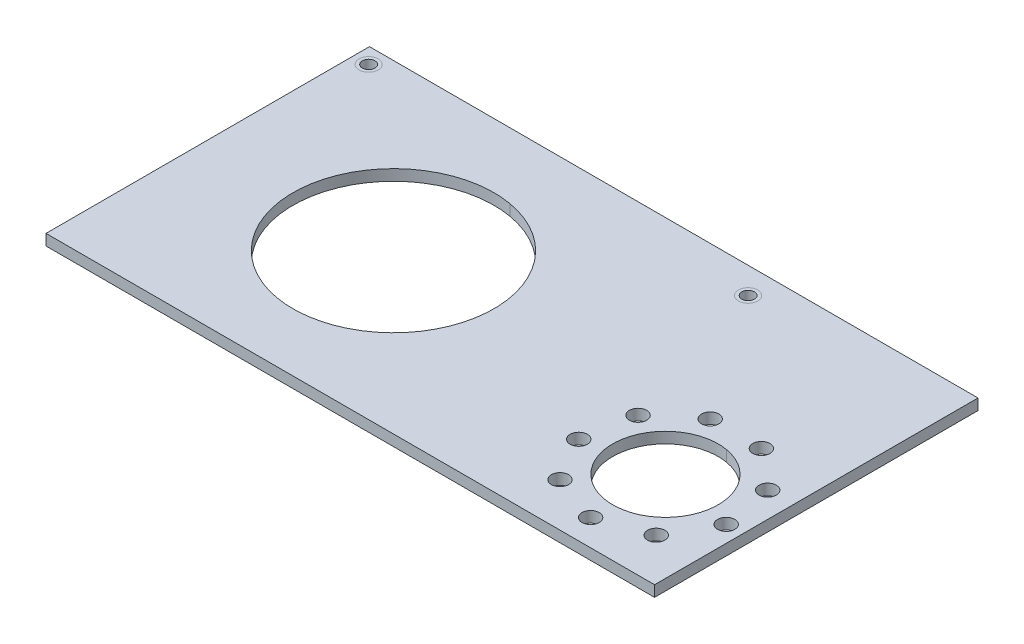
ISO-10303-21;
HEADER;
FILE_DESCRIPTION(('STEP AP214'),'2;1');
FILE_NAME('part.step','',(''),(''),'','','');
FILE_SCHEMA(('AUTOMOTIVE_DESIGN { 1 0 10303 214 1 1 1 1 }'));
ENDSEC;
DATA;
#1=APPLICATION_CONTEXT('core data for automotive mechanical design processes');
#2=APPLICATION_PROTOCOL_DEFINITION('international standard','automotive_design',2000,#1);
#3=PRODUCT_CONTEXT('',#1,'mechanical');
#4=PRODUCT('Part','Part','',(#3));
#5=PRODUCT_RELATED_PRODUCT_CATEGORY('part','',(#4));
#6=PRODUCT_DEFINITION_FORMATION('','',#4);
#7=PRODUCT_DEFINITION_CONTEXT('part definition',#1,'design');
#8=PRODUCT_DEFINITION('design','',#6,#7);
#9=PRODUCT_DEFINITION_SHAPE('','',#8);
#10=(LENGTH_UNIT() NAMED_UNIT(*) SI_UNIT(.MILLI.,.METRE.));
#11=(NAMED_UNIT(*) PLANE_ANGLE_UNIT() SI_UNIT($,.RADIAN.));
#12=(NAMED_UNIT(*) SI_UNIT($,.STERADIAN.) SOLID_ANGLE_UNIT());
#13=UNCERTAINTY_MEASURE_WITH_UNIT(LENGTH_MEASURE(1.E-05),#10,'distance_accuracy_value','');
#14=(GEOMETRIC_REPRESENTATION_CONTEXT(3) GLOBAL_UNCERTAINTY_ASSIGNED_CONTEXT((#13)) GLOBAL_UNIT_ASSIGNED_CONTEXT((#10,
#11,#12)) REPRESENTATION_CONTEXT('',''));
#15=CARTESIAN_POINT('',(0.,0.,0.));
#16=DIRECTION('',(0.,0.,1.));
#17=DIRECTION('',(1.,0.,0.));
#18=AXIS2_PLACEMENT_3D('',#15,#16,#17);
#19=CARTESIAN_POINT('',(0.,0.,0.));
#20=DIRECTION('',(0.,1.,0.));
#21=DIRECTION('',(0.,0.,1.));
#22=AXIS2_PLACEMENT_3D('',#19,#20,#21);
#23=PLANE('',#22);
#24=CARTESIAN_POINT('',(-556.683214871715,0.,24.7614199820488));
#25=DIRECTION('',(0.,1.,0.));
#26=DIRECTION('',(0.,0.,1.));
#27=AXIS2_PLACEMENT_3D('',#24,#25,#26);
#28=CIRCLE('',#27,5.00000000000004);
#29=CARTESIAN_POINT('',(-556.683214871715,0.,29.7614199820489));
#30=VERTEX_POINT('',#29);
#31=EDGE_CURVE('E52',#30,#30,#28,.F.);
#32=ORIENTED_EDGE('',*,*,#31,.F.);
#33=EDGE_LOOP('',(#32));
#34=FACE_BOUND('',#33,.T.);
#35=CARTESIAN_POINT('',(-497.518508898,0.,166.));
#36=DIRECTION('',(0.,1.,0.));
#37=DIRECTION('',(0.,0.,1.));
#38=AXIS2_PLACEMENT_3D('',#35,#36,#37);
#39=CIRCLE('',#38,4.50000000000002);
#40=CARTESIAN_POINT('',(-497.518508898,0.,170.5));
#41=VERTEX_POINT('',#40);
#42=EDGE_CURVE('E179',#41,#41,#39,.T.);
#43=ORIENTED_EDGE('',*,*,#42,.T.);
#44=EDGE_LOOP('',(#43));
#45=FACE_BOUND('',#44,.T.);
#46=CARTESIAN_POINT('',(-522.587225675775,0.,156.87573328164));
#47=DIRECTION('',(0.,1.,0.));
#48=DIRECTION('',(0.,0.,1.));
#49=AXIS2_PLACEMENT_3D('',#46,#47,#48);
#50=CIRCLE('',#49,4.50000000000002);
#51=CARTESIAN_POINT('',(-522.587225675775,0.,161.375733281641));
#52=VERTEX_POINT('',#51);
#53=EDGE_CURVE('E183',#52,#52,#50,.T.);
#54=ORIENTED_EDGE('',*,*,#53,.T.);
#55=EDGE_LOOP('',(#54));
#56=FACE_BOUND('',#55,.T.);
#57=CARTESIAN_POINT('',(-472.449792120225,0.,156.87573328164));
#58=DIRECTION('',(0.,1.,0.));
#59=DIRECTION('',(0.,0.,1.));
#60=AXIS2_PLACEMENT_3D('',#57,#58,#59);
#61=CIRCLE('',#60,4.49999999999996);
#62=CARTESIAN_POINT('',(-472.449792120225,0.,161.37573328164));
#63=VERTEX_POINT('',#62);
#64=EDGE_CURVE('E187',#63,#63,#61,.T.);
#65=ORIENTED_EDGE('',*,*,#64,.T.);
#66=EDGE_LOOP('',(#65));
#67=FACE_BOUND('',#66,.T.);
#68=CARTESIAN_POINT('',(-535.926011265476,0.,133.772278929011));
#69=DIRECTION('',(0.,1.,0.));
#70=DIRECTION('',(0.,0.,1.));
#71=AXIS2_PLACEMENT_3D('',#68,#69,#70);
#72=CIRCLE('',#71,4.50000000000002);
#73=CARTESIAN_POINT('',(-535.926011265476,0.,138.272278929011));
#74=VERTEX_POINT('',#73);
#75=EDGE_CURVE('E191',#74,#74,#72,.T.);
#76=ORIENTED_EDGE('',*,*,#75,.T.);
#77=EDGE_LOOP('',(#76));
#78=FACE_BOUND('',#77,.T.);
#79=CARTESIAN_POINT('',(-459.111006530524,0.,133.77227892901));
#80=DIRECTION('',(0.,1.,0.));
#81=DIRECTION('',(0.,0.,1.));
#82=AXIS2_PLACEMENT_3D('',#79,#80,#81);
#83=CIRCLE('',#82,4.49999999999996);
#84=CARTESIAN_POINT('',(-459.111006530524,0.,138.27227892901));
#85=VERTEX_POINT('',#84);
#86=EDGE_CURVE('E195',#85,#85,#83,.T.);
#87=ORIENTED_EDGE('',*,*,#86,.T.);
#88=EDGE_LOOP('',(#87));
#89=FACE_BOUND('',#88,.T.);
#90=CARTESIAN_POINT('',(-497.518508898,0.,127.));
#91=DIRECTION('',(0.,1.,0.));
#92=DIRECTION('',(0.,0.,1.));
#93=AXIS2_PLACEMENT_3D('',#90,#91,#92);
#94=CIRCLE('',#93,27.4955);
#95=CARTESIAN_POINT('',(-492.780583099284,0.,99.9157872668253));
#96=VERTEX_POINT('',#95);
#97=CARTESIAN_POINT('',(-502.256434696716,0.,154.084212733175));
#98=VERTEX_POINT('',#97);
#99=EDGE_CURVE('E198',#96,#98,#94,.T.);
#100=ORIENTED_EDGE('',*,*,#99,.T.);
#101=EDGE_CURVE('E262',#98,#96,#94,.T.);
#102=ORIENTED_EDGE('',*,*,#101,.T.);
#103=EDGE_LOOP('',(#100,#102));
#104=FACE_BOUND('',#103,.T.);
#105=CARTESIAN_POINT('',(-531.293499645593,0.,107.5));
#106=DIRECTION('',(0.,1.,0.));
#107=DIRECTION('',(0.,0.,1.));
#108=AXIS2_PLACEMENT_3D('',#105,#106,#107);
#109=CIRCLE('',#108,4.50000000000002);
#110=CARTESIAN_POINT('',(-531.293499645593,0.,112.));
#111=VERTEX_POINT('',#110);
#112=EDGE_CURVE('E202',#111,#111,#109,.T.);
#113=ORIENTED_EDGE('',*,*,#112,.T.);
#114=EDGE_LOOP('',(#113));
#115=FACE_BOUND('',#114,.T.);
#116=CARTESIAN_POINT('',(-463.743518150407,0.,107.5));
#117=DIRECTION('',(0.,1.,0.));
#118=DIRECTION('',(0.,0.,1.));
#119=AXIS2_PLACEMENT_3D('',#116,#117,#118);
#120=CIRCLE('',#119,4.49999999999996);
#121=CARTESIAN_POINT('',(-463.743518150407,0.,112.));
#122=VERTEX_POINT('',#121);
#123=EDGE_CURVE('E206',#122,#122,#120,.T.);
#124=ORIENTED_EDGE('',*,*,#123,.T.);
#125=EDGE_LOOP('',(#124));
#126=FACE_BOUND('',#125,.T.);
#127=CARTESIAN_POINT('',(-510.857294487701,0.,90.3519877893497));
#128=DIRECTION('',(0.,1.,0.));
#129=DIRECTION('',(0.,0.,1.));
#130=AXIS2_PLACEMENT_3D('',#127,#128,#129);
#131=CIRCLE('',#130,4.50000000000002);
#132=CARTESIAN_POINT('',(-510.857294487701,0.,94.8519877893497));
#133=VERTEX_POINT('',#132);
#134=EDGE_CURVE('E210',#133,#133,#131,.T.);
#135=ORIENTED_EDGE('',*,*,#134,.T.);
#136=EDGE_LOOP('',(#135));
#137=FACE_BOUND('',#136,.T.);
#138=CARTESIAN_POINT('',(-484.179723308299,0.,90.3519877893495));
#139=DIRECTION('',(0.,1.,0.));
#140=DIRECTION('',(0.,0.,1.));
#141=AXIS2_PLACEMENT_3D('',#138,#139,#140);
#142=CIRCLE('',#141,4.49999999999996);
#143=CARTESIAN_POINT('',(-484.179723308299,0.,94.8519877893495));
#144=VERTEX_POINT('',#143);
#145=EDGE_CURVE('E214',#144,#144,#142,.T.);
#146=ORIENTED_EDGE('',*,*,#145,.T.);
#147=EDGE_LOOP('',(#146));
#148=FACE_BOUND('',#147,.T.);
#149=DIRECTION('',(0.,0.,1.));
#150=VECTOR('',#149,1.);
#151=CARTESIAN_POINT('',(-767.637595370689,0.,11.1167158933512));
#152=LINE('',#151,#150);
#153=CARTESIAN_POINT('',(-767.637595370689,0.,11.1167158933512));
#154=VERTEX_POINT('',#153);
#155=CARTESIAN_POINT('',(-767.637595370689,0.,179.652791477189));
#156=VERTEX_POINT('',#155);
#157=EDGE_CURVE('E132',#154,#156,#152,.T.);
#158=ORIENTED_EDGE('',*,*,#157,.F.);
#159=DIRECTION('',(-1.,0.,0.));
#160=VECTOR('',#159,1.);
#161=CARTESIAN_POINT('',(-767.637595370689,0.,11.1167158933512));
#162=LINE('',#161,#160);
#163=CARTESIAN_POINT('',(-450.542678287043,0.,11.1167158933512));
#164=VERTEX_POINT('',#163);
#165=EDGE_CURVE('E129',#164,#154,#162,.T.);
#166=ORIENTED_EDGE('',*,*,#165,.F.);
#167=DIRECTION('',(0.,0.,-1.));
#168=VECTOR('',#167,1.);
#169=CARTESIAN_POINT('',(-450.542678287043,0.,11.1167158933512));
#170=LINE('',#169,#168);
#171=CARTESIAN_POINT('',(-450.542678287043,0.,179.652791477189));
#172=VERTEX_POINT('',#171);
#173=EDGE_CURVE('E290',#172,#164,#170,.T.);
#174=ORIENTED_EDGE('',*,*,#173,.F.);
#175=DIRECTION('',(1.,0.,0.));
#176=VECTOR('',#175,1.);
#177=CARTESIAN_POINT('',(-767.637595370689,0.,179.652791477189));
#178=LINE('',#177,#176);
#179=EDGE_CURVE('E288',#156,#172,#178,.T.);
#180=ORIENTED_EDGE('',*,*,#179,.F.);
#181=EDGE_LOOP('',(#158,#166,#174,#180));
#182=FACE_BOUND('',#181,.T.);
#183=CARTESIAN_POINT('',(-759.817588697628,0.,19.3463383980246));
#184=DIRECTION('',(0.,1.,0.));
#185=DIRECTION('',(0.,0.,1.));
#186=AXIS2_PLACEMENT_3D('',#183,#184,#185);
#187=CIRCLE('',#186,5.00000000000004);
#188=CARTESIAN_POINT('',(-759.817588697628,0.,24.3463383980246));
#189=VERTEX_POINT('',#188);
#190=EDGE_CURVE('E159',#189,#189,#187,.F.);
#191=ORIENTED_EDGE('',*,*,#190,.F.);
#192=EDGE_LOOP('',(#191));
#193=FACE_BOUND('',#192,.T.);
#194=CARTESIAN_POINT('',(-669.29,0.,96.9514773719377));
#195=DIRECTION('',(0.,1.,0.));
#196=DIRECTION('',(0.,0.,1.));
#197=AXIS2_PLACEMENT_3D('',#194,#195,#196);
#198=CIRCLE('',#197,61.9125);
#199=CARTESIAN_POINT('',(-669.29,0.,158.863977371938));
#200=VERTEX_POINT('',#199);
#201=EDGE_CURVE('E11',#200,#200,#198,.F.);
#202=ORIENTED_EDGE('',*,*,#201,.F.);
#203=EDGE_LOOP('',(#202));
#204=FACE_BOUND('',#203,.T.);
#205=ADVANCED_FACE('F43',(#34,#45,#56,#67,#78,#89,#104,#115,#126,#137,#148,#182,#193,#204),#23,.F.);
#206=ORIENTED_EDGE('',*,*,#201,.T.);
#207=EDGE_LOOP('',(#206));
#208=FACE_BOUND('',#207,.T.);
#209=CARTESIAN_POINT('',(-669.29,0.,96.9514773719377));
#210=DIRECTION('',(0.,1.,0.));
#211=DIRECTION('',(0.,0.,1.));
#212=AXIS2_PLACEMENT_3D('',#209,#210,#211);
#213=CIRCLE('',#212,52.3875);
#214=CARTESIAN_POINT('',(-660.262774171038,0.,45.347607845681));
#215=VERTEX_POINT('',#214);
#216=CARTESIAN_POINT('',(-678.317225828962,0.,148.555346898194));
#217=VERTEX_POINT('',#216);
#218=EDGE_CURVE('E225',#215,#217,#213,.T.);
#219=ORIENTED_EDGE('',*,*,#218,.T.);
#220=EDGE_CURVE('E227',#217,#215,#213,.T.);
#221=ORIENTED_EDGE('',*,*,#220,.T.);
#222=EDGE_LOOP('',(#219,#221));
#223=FACE_BOUND('',#222,.T.);
#224=ADVANCED_FACE('F173',(#208,#223),#23,.F.);
#225=ORIENTED_EDGE('',*,*,#31,.T.);
#226=EDGE_LOOP('',(#225));
#227=FACE_BOUND('',#226,.T.);
#228=CARTESIAN_POINT('',(-556.683214871715,0.,24.7614199820488));
#229=DIRECTION('',(0.,1.,0.));
#230=DIRECTION('',(0.,0.,1.));
#231=AXIS2_PLACEMENT_3D('',#228,#229,#230);
#232=CIRCLE('',#231,3.30000000000019);
#233=CARTESIAN_POINT('',(-556.683214871715,0.,28.061419982049));
#234=VERTEX_POINT('',#233);
#235=EDGE_CURVE('E240',#234,#234,#232,.T.);
#236=ORIENTED_EDGE('',*,*,#235,.T.);
#237=EDGE_LOOP('',(#236));
#238=FACE_BOUND('',#237,.T.);
#239=ADVANCED_FACE('F168',(#227,#238),#23,.F.);
#240=CARTESIAN_POINT('',(0.,5.715,0.));
#241=DIRECTION('',(0.,1.,0.));
#242=DIRECTION('',(0.,0.,1.));
#243=AXIS2_PLACEMENT_3D('',#240,#241,#242);
#244=PLANE('',#243);
#245=CARTESIAN_POINT('',(-556.683214871715,5.715,24.7614199820488));
#246=DIRECTION('',(0.,1.,0.));
#247=DIRECTION('',(0.,0.,1.));
#248=AXIS2_PLACEMENT_3D('',#245,#246,#247);
#249=CIRCLE('',#248,5.00000000000004);
#250=CARTESIAN_POINT('',(-556.683214871715,5.715,29.7614199820489));
#251=VERTEX_POINT('',#250);
#252=EDGE_CURVE('E151',#251,#251,#249,.F.);
#253=ORIENTED_EDGE('',*,*,#252,.T.);
#254=EDGE_LOOP('',(#253));
#255=FACE_BOUND('',#254,.T.);
#256=CARTESIAN_POINT('',(-669.29,5.715,96.9514773719377));
#257=DIRECTION('',(0.,1.,0.));
#258=DIRECTION('',(0.,0.,1.));
#259=AXIS2_PLACEMENT_3D('',#256,#257,#258);
#260=CIRCLE('',#259,52.3875);
#261=CARTESIAN_POINT('',(-660.262774171038,5.715,45.347607845681));
#262=VERTEX_POINT('',#261);
#263=CARTESIAN_POINT('',(-678.317225828962,5.715,148.555346898194));
#264=VERTEX_POINT('',#263);
#265=EDGE_CURVE('E232',#262,#264,#260,.T.);
#266=ORIENTED_EDGE('',*,*,#265,.F.);
#267=EDGE_CURVE('E230',#264,#262,#260,.T.);
#268=ORIENTED_EDGE('',*,*,#267,.F.);
#269=EDGE_LOOP('',(#266,#268));
#270=FACE_BOUND('',#269,.T.);
#271=CARTESIAN_POINT('',(-497.518508898,5.715,166.));
#272=DIRECTION('',(0.,1.,0.));
#273=DIRECTION('',(0.,0.,1.));
#274=AXIS2_PLACEMENT_3D('',#271,#272,#273);
#275=CIRCLE('',#274,4.50000000000002);
#276=CARTESIAN_POINT('',(-497.518508898,5.715,170.5));
#277=VERTEX_POINT('',#276);
#278=EDGE_CURVE('E243',#277,#277,#275,.T.);
#279=ORIENTED_EDGE('',*,*,#278,.F.);
#280=EDGE_LOOP('',(#279));
#281=FACE_BOUND('',#280,.T.);
#282=CARTESIAN_POINT('',(-472.449792120225,5.715,156.87573328164));
#283=DIRECTION('',(0.,1.,0.));
#284=DIRECTION('',(0.,0.,1.));
#285=AXIS2_PLACEMENT_3D('',#282,#283,#284);
#286=CIRCLE('',#285,4.49999999999996);
#287=CARTESIAN_POINT('',(-472.449792120225,5.715,161.37573328164));
#288=VERTEX_POINT('',#287);
#289=EDGE_CURVE('E251',#288,#288,#286,.T.);
#290=ORIENTED_EDGE('',*,*,#289,.F.);
#291=EDGE_LOOP('',(#290));
#292=FACE_BOUND('',#291,.T.);
#293=CARTESIAN_POINT('',(-459.111006530524,5.715,133.77227892901));
#294=DIRECTION('',(0.,1.,0.));
#295=DIRECTION('',(0.,0.,1.));
#296=AXIS2_PLACEMENT_3D('',#293,#294,#295);
#297=CIRCLE('',#296,4.49999999999996);
#298=CARTESIAN_POINT('',(-459.111006530524,5.715,138.27227892901));
#299=VERTEX_POINT('',#298);
#300=EDGE_CURVE('E259',#299,#299,#297,.T.);
#301=ORIENTED_EDGE('',*,*,#300,.F.);
#302=EDGE_LOOP('',(#301));
#303=FACE_BOUND('',#302,.T.);
#304=CARTESIAN_POINT('',(-531.293499645593,5.715,107.5));
#305=DIRECTION('',(0.,1.,0.));
#306=DIRECTION('',(0.,0.,1.));
#307=AXIS2_PLACEMENT_3D('',#304,#305,#306);
#308=CIRCLE('',#307,4.50000000000002);
#309=CARTESIAN_POINT('',(-531.293499645593,5.715,112.));
#310=VERTEX_POINT('',#309);
#311=EDGE_CURVE('E268',#310,#310,#308,.T.);
#312=ORIENTED_EDGE('',*,*,#311,.F.);
#313=EDGE_LOOP('',(#312));
#314=FACE_BOUND('',#313,.T.);
#315=CARTESIAN_POINT('',(-510.857294487701,5.715,90.3519877893497));
#316=DIRECTION('',(0.,1.,0.));
#317=DIRECTION('',(0.,0.,1.));
#318=AXIS2_PLACEMENT_3D('',#315,#316,#317);
#319=CIRCLE('',#318,4.50000000000002);
#320=CARTESIAN_POINT('',(-510.857294487701,5.715,94.8519877893497));
#321=VERTEX_POINT('',#320);
#322=EDGE_CURVE('E276',#321,#321,#319,.T.);
#323=ORIENTED_EDGE('',*,*,#322,.F.);
#324=EDGE_LOOP('',(#323));
#325=FACE_BOUND('',#324,.T.);
#326=DIRECTION('',(0.,0.,1.));
#327=VECTOR('',#326,1.);
#328=CARTESIAN_POINT('',(-767.637595370689,5.715,11.1167158933512));
#329=LINE('',#328,#327);
#330=CARTESIAN_POINT('',(-767.637595370689,5.715,11.1167158933512));
#331=VERTEX_POINT('',#330);
#332=CARTESIAN_POINT('',(-767.637595370689,5.715,179.652791477189));
#333=VERTEX_POINT('',#332);
#334=EDGE_CURVE('E119',#331,#333,#329,.T.);
#335=ORIENTED_EDGE('',*,*,#334,.T.);
#336=DIRECTION('',(1.,0.,0.));
#337=VECTOR('',#336,1.);
#338=CARTESIAN_POINT('',(-767.637595370689,5.715,179.652791477189));
#339=LINE('',#338,#337);
#340=CARTESIAN_POINT('',(-450.542678287043,5.715,179.652791477189));
#341=VERTEX_POINT('',#340);
#342=EDGE_CURVE('E108',#333,#341,#339,.T.);
#343=ORIENTED_EDGE('',*,*,#342,.T.);
#344=DIRECTION('',(0.,0.,-1.));
#345=VECTOR('',#344,1.);
#346=CARTESIAN_POINT('',(-450.542678287043,5.715,11.1167158933512));
#347=LINE('',#346,#345);
#348=CARTESIAN_POINT('',(-450.542678287043,5.715,11.1167158933512));
#349=VERTEX_POINT('',#348);
#350=EDGE_CURVE('E118',#341,#349,#347,.T.);
#351=ORIENTED_EDGE('',*,*,#350,.T.);
#352=DIRECTION('',(-1.,0.,0.));
#353=VECTOR('',#352,1.);
#354=CARTESIAN_POINT('',(-767.637595370689,5.715,11.1167158933512));
#355=LINE('',#354,#353);
#356=EDGE_CURVE('E125',#349,#331,#355,.T.);
#357=ORIENTED_EDGE('',*,*,#356,.T.);
#358=EDGE_LOOP('',(#335,#343,#351,#357));
#359=FACE_BOUND('',#358,.T.);
#360=CARTESIAN_POINT('',(-484.179723308299,5.715,90.3519877893495));
#361=DIRECTION('',(0.,1.,0.));
#362=DIRECTION('',(0.,0.,1.));
#363=AXIS2_PLACEMENT_3D('',#360,#361,#362);
#364=CIRCLE('',#363,4.49999999999996);
#365=CARTESIAN_POINT('',(-484.179723308299,5.715,94.8519877893495));
#366=VERTEX_POINT('',#365);
#367=EDGE_CURVE('E280',#366,#366,#364,.T.);
#368=ORIENTED_EDGE('',*,*,#367,.F.);
#369=EDGE_LOOP('',(#368));
#370=FACE_BOUND('',#369,.T.);
#371=CARTESIAN_POINT('',(-463.743518150407,5.715,107.5));
#372=DIRECTION('',(0.,1.,0.));
#373=DIRECTION('',(0.,0.,1.));
#374=AXIS2_PLACEMENT_3D('',#371,#372,#373);
#375=CIRCLE('',#374,4.49999999999996);
#376=CARTESIAN_POINT('',(-463.743518150407,5.715,112.));
#377=VERTEX_POINT('',#376);
#378=EDGE_CURVE('E272',#377,#377,#375,.T.);
#379=ORIENTED_EDGE('',*,*,#378,.F.);
#380=EDGE_LOOP('',(#379));
#381=FACE_BOUND('',#380,.T.);
#382=CARTESIAN_POINT('',(-497.518508898,5.715,127.));
#383=DIRECTION('',(0.,1.,0.));
#384=DIRECTION('',(0.,0.,1.));
#385=AXIS2_PLACEMENT_3D('',#382,#383,#384);
#386=CIRCLE('',#385,27.4955);
#387=CARTESIAN_POINT('',(-492.780583099284,5.715,99.9157872668253));
#388=VERTEX_POINT('',#387);
#389=CARTESIAN_POINT('',(-502.256434696716,5.715,154.084212733175));
#390=VERTEX_POINT('',#389);
#391=EDGE_CURVE('E264',#388,#390,#386,.T.);
#392=ORIENTED_EDGE('',*,*,#391,.F.);
#393=EDGE_CURVE('E266',#390,#388,#386,.T.);
#394=ORIENTED_EDGE('',*,*,#393,.F.);
#395=EDGE_LOOP('',(#392,#394));
#396=FACE_BOUND('',#395,.T.);
#397=CARTESIAN_POINT('',(-535.926011265476,5.715,133.772278929011));
#398=DIRECTION('',(0.,1.,0.));
#399=DIRECTION('',(0.,0.,1.));
#400=AXIS2_PLACEMENT_3D('',#397,#398,#399);
#401=CIRCLE('',#400,4.50000000000002);
#402=CARTESIAN_POINT('',(-535.926011265476,5.715,138.272278929011));
#403=VERTEX_POINT('',#402);
#404=EDGE_CURVE('E255',#403,#403,#401,.T.);
#405=ORIENTED_EDGE('',*,*,#404,.F.);
#406=EDGE_LOOP('',(#405));
#407=FACE_BOUND('',#406,.T.);
#408=CARTESIAN_POINT('',(-522.587225675775,5.715,156.87573328164));
#409=DIRECTION('',(0.,1.,0.));
#410=DIRECTION('',(0.,0.,1.));
#411=AXIS2_PLACEMENT_3D('',#408,#409,#410);
#412=CIRCLE('',#411,4.50000000000002);
#413=CARTESIAN_POINT('',(-522.587225675775,5.715,161.375733281641));
#414=VERTEX_POINT('',#413);
#415=EDGE_CURVE('E247',#414,#414,#412,.T.);
#416=ORIENTED_EDGE('',*,*,#415,.F.);
#417=EDGE_LOOP('',(#416));
#418=FACE_BOUND('',#417,.T.);
#419=CARTESIAN_POINT('',(-759.817588697628,5.715,19.3463383980246));
#420=DIRECTION('',(0.,1.,0.));
#421=DIRECTION('',(0.,0.,1.));
#422=AXIS2_PLACEMENT_3D('',#419,#420,#421);
#423=CIRCLE('',#422,5.00000000000004);
#424=CARTESIAN_POINT('',(-759.817588697628,5.715,24.3463383980246));
#425=VERTEX_POINT('',#424);
#426=EDGE_CURVE('E155',#425,#425,#423,.F.);
#427=ORIENTED_EDGE('',*,*,#426,.T.);
#428=EDGE_LOOP('',(#427));
#429=FACE_BOUND('',#428,.T.);
#430=ADVANCED_FACE('F122',(#255,#270,#281,#292,#303,#314,#325,#359,#370,#381,#396,#407,#418,
#429),#244,.T.);
#431=ORIENTED_EDGE('',*,*,#426,.F.);
#432=EDGE_LOOP('',(#431));
#433=FACE_BOUND('',#432,.T.);
#434=CARTESIAN_POINT('',(-759.817588697628,5.715,19.3463383980246));
#435=DIRECTION('',(0.,1.,0.));
#436=DIRECTION('',(0.,0.,1.));
#437=AXIS2_PLACEMENT_3D('',#434,#435,#436);
#438=CIRCLE('',#437,3.30000000000021);
#439=CARTESIAN_POINT('',(-759.817588697628,5.715,22.6463383980248));
#440=VERTEX_POINT('',#439);
#441=EDGE_CURVE('E234',#440,#440,#438,.T.);
#442=ORIENTED_EDGE('',*,*,#441,.F.);
#443=EDGE_LOOP('',(#442));
#444=FACE_BOUND('',#443,.T.);
#445=ADVANCED_FACE('F316',(#433,#444),#244,.T.);
#446=CARTESIAN_POINT('',(-497.518508898,5.715,127.));
#447=DIRECTION('',(0.,-1.,0.));
#448=DIRECTION('',(0.,0.,-1.));
#449=AXIS2_PLACEMENT_3D('',#446,#447,#448);
#450=CYLINDRICAL_SURFACE('',#449,27.4955);
#451=ORIENTED_EDGE('',*,*,#391,.T.);
#452=DIRECTION('',(0.,-1.,0.));
#453=VECTOR('',#452,1.);
#454=CARTESIAN_POINT('',(-502.256434696716,5.715,154.084212733175));
#455=LINE('',#454,#453);
#456=EDGE_CURVE('E59',#390,#98,#455,.T.);
#457=ORIENTED_EDGE('',*,*,#456,.T.);
#458=ORIENTED_EDGE('',*,*,#99,.F.);
#459=DIRECTION('',(0.,1.,0.));
#460=VECTOR('',#459,1.);
#461=CARTESIAN_POINT('',(-492.780583099284,5.715,99.9157872668253));
#462=LINE('',#461,#460);
#463=EDGE_CURVE('E145',#96,#388,#462,.T.);
#464=ORIENTED_EDGE('',*,*,#463,.T.);
#465=EDGE_LOOP('',(#451,#457,#458,#464));
#466=FACE_BOUND('',#465,.T.);
#467=ADVANCED_FACE('F336',(#466),#450,.F.);
#468=CARTESIAN_POINT('',(-669.29,5.715,96.9514773719377));
#469=DIRECTION('',(0.,-1.,0.));
#470=DIRECTION('',(0.,0.,-1.));
#471=AXIS2_PLACEMENT_3D('',#468,#469,#470);
#472=CYLINDRICAL_SURFACE('',#471,52.3875);
#473=ORIENTED_EDGE('',*,*,#265,.T.);
#474=DIRECTION('',(0.,-1.,0.));
#475=VECTOR('',#474,1.);
#476=CARTESIAN_POINT('',(-678.317225828962,5.715,148.555346898194));
#477=LINE('',#476,#475);
#478=EDGE_CURVE('E137',#264,#217,#477,.T.);
#479=ORIENTED_EDGE('',*,*,#478,.T.);
#480=ORIENTED_EDGE('',*,*,#218,.F.);
#481=DIRECTION('',(0.,1.,0.));
#482=VECTOR('',#481,1.);
#483=CARTESIAN_POINT('',(-660.262774171038,5.715,45.347607845681));
#484=LINE('',#483,#482);
#485=EDGE_CURVE('E133',#215,#262,#484,.T.);
#486=ORIENTED_EDGE('',*,*,#485,.T.);
#487=EDGE_LOOP('',(#473,#479,#480,#486));
#488=FACE_BOUND('',#487,.T.);
#489=ADVANCED_FACE('F314',(#488),#472,.F.);
#490=ORIENTED_EDGE('',*,*,#252,.F.);
#491=EDGE_LOOP('',(#490));
#492=FACE_BOUND('',#491,.T.);
#493=CARTESIAN_POINT('',(-556.683214871715,5.715,24.7614199820488));
#494=DIRECTION('',(0.,1.,0.));
#495=DIRECTION('',(0.,0.,1.));
#496=AXIS2_PLACEMENT_3D('',#493,#494,#495);
#497=CIRCLE('',#496,3.30000000000019);
#498=CARTESIAN_POINT('',(-556.683214871715,5.715,28.061419982049));
#499=VERTEX_POINT('',#498);
#500=EDGE_CURVE('E237',#499,#499,#497,.T.);
#501=ORIENTED_EDGE('',*,*,#500,.F.);
#502=EDGE_LOOP('',(#501));
#503=FACE_BOUND('',#502,.T.);
#504=ADVANCED_FACE('F310',(#492,#503),#244,.T.);
#505=ORIENTED_EDGE('',*,*,#190,.T.);
#506=EDGE_LOOP('',(#505));
#507=FACE_BOUND('',#506,.T.);
#508=CARTESIAN_POINT('',(-759.817588697628,0.,19.3463383980246));
#509=DIRECTION('',(0.,1.,0.));
#510=DIRECTION('',(0.,0.,1.));
#511=AXIS2_PLACEMENT_3D('',#508,#509,#510);
#512=CIRCLE('',#511,3.30000000000021);
#513=CARTESIAN_POINT('',(-759.817588697628,0.,22.6463383980248));
#514=VERTEX_POINT('',#513);
#515=EDGE_CURVE('E374',#514,#514,#512,.T.);
#516=ORIENTED_EDGE('',*,*,#515,.T.);
#517=EDGE_LOOP('',(#516));
#518=FACE_BOUND('',#517,.T.);
#519=ADVANCED_FACE('F175',(#507,#518),#23,.F.);
#520=CARTESIAN_POINT('',(-767.637595370689,5.715,11.1167158933512));
#521=DIRECTION('',(1.,0.,0.));
#522=DIRECTION('',(0.,0.,-1.));
#523=AXIS2_PLACEMENT_3D('',#520,#521,#522);
#524=PLANE('',#523);
#525=ORIENTED_EDGE('',*,*,#157,.T.);
#526=DIRECTION('',(0.,-1.,0.));
#527=VECTOR('',#526,1.);
#528=CARTESIAN_POINT('',(-767.637595370689,5.715,179.652791477189));
#529=LINE('',#528,#527);
#530=EDGE_CURVE('E112',#333,#156,#529,.T.);
#531=ORIENTED_EDGE('',*,*,#530,.F.);
#532=ORIENTED_EDGE('',*,*,#334,.F.);
#533=DIRECTION('',(0.,-1.,0.));
#534=VECTOR('',#533,1.);
#535=CARTESIAN_POINT('',(-767.637595370689,5.715,11.1167158933512));
#536=LINE('',#535,#534);
#537=EDGE_CURVE('E286',#331,#154,#536,.T.);
#538=ORIENTED_EDGE('',*,*,#537,.T.);
#539=EDGE_LOOP('',(#525,#531,#532,#538));
#540=FACE_BOUND('',#539,.T.);
#541=ADVANCED_FACE('F45',(#540),#524,.F.);
#542=CARTESIAN_POINT('',(-767.637595370689,5.715,179.652791477189));
#543=DIRECTION('',(0.,0.,-1.));
#544=DIRECTION('',(-1.,0.,0.));
#545=AXIS2_PLACEMENT_3D('',#542,#543,#544);
#546=PLANE('',#545);
#547=ORIENTED_EDGE('',*,*,#179,.T.);
#548=DIRECTION('',(0.,-1.,0.));
#549=VECTOR('',#548,1.);
#550=CARTESIAN_POINT('',(-450.542678287043,5.715,179.652791477189));
#551=LINE('',#550,#549);
#552=EDGE_CURVE('E115',#341,#172,#551,.T.);
#553=ORIENTED_EDGE('',*,*,#552,.F.);
#554=ORIENTED_EDGE('',*,*,#342,.F.);
#555=ORIENTED_EDGE('',*,*,#530,.T.);
#556=EDGE_LOOP('',(#547,#553,#554,#555));
#557=FACE_BOUND('',#556,.T.);
#558=ADVANCED_FACE('F110',(#557),#546,.F.);
#559=CARTESIAN_POINT('',(-450.542678287043,5.715,11.1167158933512));
#560=DIRECTION('',(-1.,0.,0.));
#561=DIRECTION('',(0.,0.,1.));
#562=AXIS2_PLACEMENT_3D('',#559,#560,#561);
#563=PLANE('',#562);
#564=ORIENTED_EDGE('',*,*,#173,.T.);
#565=DIRECTION('',(0.,-1.,0.));
#566=VECTOR('',#565,1.);
#567=CARTESIAN_POINT('',(-450.542678287043,5.715,11.1167158933512));
#568=LINE('',#567,#566);
#569=EDGE_CURVE('E139',#349,#164,#568,.T.);
#570=ORIENTED_EDGE('',*,*,#569,.F.);
#571=ORIENTED_EDGE('',*,*,#350,.F.);
#572=ORIENTED_EDGE('',*,*,#552,.T.);
#573=EDGE_LOOP('',(#564,#570,#571,#572));
#574=FACE_BOUND('',#573,.T.);
#575=ADVANCED_FACE('F299',(#574),#563,.F.);
#576=CARTESIAN_POINT('',(-767.637595370689,5.715,11.1167158933512));
#577=DIRECTION('',(0.,0.,1.));
#578=DIRECTION('',(1.,0.,0.));
#579=AXIS2_PLACEMENT_3D('',#576,#577,#578);
#580=PLANE('',#579);
#581=ORIENTED_EDGE('',*,*,#165,.T.);
#582=ORIENTED_EDGE('',*,*,#537,.F.);
#583=ORIENTED_EDGE('',*,*,#356,.F.);
#584=ORIENTED_EDGE('',*,*,#569,.T.);
#585=EDGE_LOOP('',(#581,#582,#583,#584));
#586=FACE_BOUND('',#585,.T.);
#587=ADVANCED_FACE('F296',(#586),#580,.F.);
#588=CARTESIAN_POINT('',(-484.179723308299,5.715,90.3519877893495));
#589=DIRECTION('',(0.,-1.,0.));
#590=DIRECTION('',(0.,0.,-1.));
#591=AXIS2_PLACEMENT_3D('',#588,#589,#590);
#592=CYLINDRICAL_SURFACE('',#591,4.49999999999996);
#593=ORIENTED_EDGE('',*,*,#367,.T.);
#594=EDGE_LOOP('',(#593));
#595=FACE_BOUND('',#594,.T.);
#596=ORIENTED_EDGE('',*,*,#145,.F.);
#597=EDGE_LOOP('',(#596));
#598=FACE_BOUND('',#597,.T.);
#599=ADVANCED_FACE('F306',(#595,#598),#592,.F.);
#600=CARTESIAN_POINT('',(-510.857294487701,5.715,90.3519877893497));
#601=DIRECTION('',(0.,-1.,0.));
#602=DIRECTION('',(0.,0.,-1.));
#603=AXIS2_PLACEMENT_3D('',#600,#601,#602);
#604=CYLINDRICAL_SURFACE('',#603,4.50000000000002);
#605=ORIENTED_EDGE('',*,*,#322,.T.);
#606=EDGE_LOOP('',(#605));
#607=FACE_BOUND('',#606,.T.);
#608=ORIENTED_EDGE('',*,*,#134,.F.);
#609=EDGE_LOOP('',(#608));
#610=FACE_BOUND('',#609,.T.);
#611=ADVANCED_FACE('F319',(#607,#610),#604,.F.);
#612=CARTESIAN_POINT('',(-463.743518150407,5.715,107.5));
#613=DIRECTION('',(0.,-1.,0.));
#614=DIRECTION('',(0.,0.,-1.));
#615=AXIS2_PLACEMENT_3D('',#612,#613,#614);
#616=CYLINDRICAL_SURFACE('',#615,4.49999999999996);
#617=ORIENTED_EDGE('',*,*,#378,.T.);
#618=EDGE_LOOP('',(#617));
#619=FACE_BOUND('',#618,.T.);
#620=ORIENTED_EDGE('',*,*,#123,.F.);
#621=EDGE_LOOP('',(#620));
#622=FACE_BOUND('',#621,.T.);
#623=ADVANCED_FACE('F323',(#619,#622),#616,.F.);
#624=CARTESIAN_POINT('',(-531.293499645593,5.715,107.5));
#625=DIRECTION('',(0.,-1.,0.));
#626=DIRECTION('',(0.,0.,-1.));
#627=AXIS2_PLACEMENT_3D('',#624,#625,#626);
#628=CYLINDRICAL_SURFACE('',#627,4.50000000000002);
#629=ORIENTED_EDGE('',*,*,#311,.T.);
#630=EDGE_LOOP('',(#629));
#631=FACE_BOUND('',#630,.T.);
#632=ORIENTED_EDGE('',*,*,#112,.F.);
#633=EDGE_LOOP('',(#632));
#634=FACE_BOUND('',#633,.T.);
#635=ADVANCED_FACE('F327',(#631,#634),#628,.F.);
#636=ORIENTED_EDGE('',*,*,#456,.F.);
#637=ORIENTED_EDGE('',*,*,#393,.T.);
#638=ORIENTED_EDGE('',*,*,#463,.F.);
#639=ORIENTED_EDGE('',*,*,#101,.F.);
#640=EDGE_LOOP('',(#636,#637,#638,#639));
#641=FACE_BOUND('',#640,.T.);
#642=ADVANCED_FACE('F331',(#641),#450,.F.);
#643=CARTESIAN_POINT('',(-459.111006530524,5.715,133.77227892901));
#644=DIRECTION('',(0.,-1.,0.));
#645=DIRECTION('',(0.,0.,-1.));
#646=AXIS2_PLACEMENT_3D('',#643,#644,#645);
#647=CYLINDRICAL_SURFACE('',#646,4.49999999999996);
#648=ORIENTED_EDGE('',*,*,#300,.T.);
#649=EDGE_LOOP('',(#648));
#650=FACE_BOUND('',#649,.T.);
#651=ORIENTED_EDGE('',*,*,#86,.F.);
#652=EDGE_LOOP('',(#651));
#653=FACE_BOUND('',#652,.T.);
#654=ADVANCED_FACE('F335',(#650,#653),#647,.F.);
#655=CARTESIAN_POINT('',(-535.926011265476,5.715,133.772278929011));
#656=DIRECTION('',(0.,-1.,0.));
#657=DIRECTION('',(0.,0.,-1.));
#658=AXIS2_PLACEMENT_3D('',#655,#656,#657);
#659=CYLINDRICAL_SURFACE('',#658,4.50000000000002);
#660=ORIENTED_EDGE('',*,*,#404,.T.);
#661=EDGE_LOOP('',(#660));
#662=FACE_BOUND('',#661,.T.);
#663=ORIENTED_EDGE('',*,*,#75,.F.);
#664=EDGE_LOOP('',(#663));
#665=FACE_BOUND('',#664,.T.);
#666=ADVANCED_FACE('F339',(#662,#665),#659,.F.);
#667=CARTESIAN_POINT('',(-472.449792120225,5.715,156.87573328164));
#668=DIRECTION('',(0.,-1.,0.));
#669=DIRECTION('',(0.,0.,-1.));
#670=AXIS2_PLACEMENT_3D('',#667,#668,#669);
#671=CYLINDRICAL_SURFACE('',#670,4.49999999999996);
#672=ORIENTED_EDGE('',*,*,#289,.T.);
#673=EDGE_LOOP('',(#672));
#674=FACE_BOUND('',#673,.T.);
#675=ORIENTED_EDGE('',*,*,#64,.F.);
#676=EDGE_LOOP('',(#675));
#677=FACE_BOUND('',#676,.T.);
#678=ADVANCED_FACE('F343',(#674,#677),#671,.F.);
#679=CARTESIAN_POINT('',(-522.587225675775,5.715,156.87573328164));
#680=DIRECTION('',(0.,-1.,0.));
#681=DIRECTION('',(0.,0.,-1.));
#682=AXIS2_PLACEMENT_3D('',#679,#680,#681);
#683=CYLINDRICAL_SURFACE('',#682,4.50000000000002);
#684=ORIENTED_EDGE('',*,*,#415,.T.);
#685=EDGE_LOOP('',(#684));
#686=FACE_BOUND('',#685,.T.);
#687=ORIENTED_EDGE('',*,*,#53,.F.);
#688=EDGE_LOOP('',(#687));
#689=FACE_BOUND('',#688,.T.);
#690=ADVANCED_FACE('F347',(#686,#689),#683,.F.);
#691=CARTESIAN_POINT('',(-497.518508898,5.715,166.));
#692=DIRECTION('',(0.,-1.,0.));
#693=DIRECTION('',(0.,0.,-1.));
#694=AXIS2_PLACEMENT_3D('',#691,#692,#693);
#695=CYLINDRICAL_SURFACE('',#694,4.50000000000002);
#696=ORIENTED_EDGE('',*,*,#278,.T.);
#697=EDGE_LOOP('',(#696));
#698=FACE_BOUND('',#697,.T.);
#699=ORIENTED_EDGE('',*,*,#42,.F.);
#700=EDGE_LOOP('',(#699));
#701=FACE_BOUND('',#700,.T.);
#702=ADVANCED_FACE('F351',(#698,#701),#695,.F.);
#703=CARTESIAN_POINT('',(-556.683214871715,5.715,24.7614199820488));
#704=DIRECTION('',(0.,-1.,0.));
#705=DIRECTION('',(0.,0.,-1.));
#706=AXIS2_PLACEMENT_3D('',#703,#704,#705);
#707=CYLINDRICAL_SURFACE('',#706,3.30000000000019);
#708=ORIENTED_EDGE('',*,*,#235,.F.);
#709=EDGE_LOOP('',(#708));
#710=FACE_BOUND('',#709,.T.);
#711=ORIENTED_EDGE('',*,*,#500,.T.);
#712=EDGE_LOOP('',(#711));
#713=FACE_BOUND('',#712,.T.);
#714=ADVANCED_FACE('F355',(#710,#713),#707,.F.);
#715=ORIENTED_EDGE('',*,*,#478,.F.);
#716=ORIENTED_EDGE('',*,*,#267,.T.);
#717=ORIENTED_EDGE('',*,*,#485,.F.);
#718=ORIENTED_EDGE('',*,*,#220,.F.);
#719=EDGE_LOOP('',(#715,#716,#717,#718));
#720=FACE_BOUND('',#719,.T.);
#721=ADVANCED_FACE('F359',(#720),#472,.F.);
#722=CARTESIAN_POINT('',(-759.817588697628,5.715,19.3463383980246));
#723=DIRECTION('',(0.,-1.,0.));
#724=DIRECTION('',(0.,0.,-1.));
#725=AXIS2_PLACEMENT_3D('',#722,#723,#724);
#726=CYLINDRICAL_SURFACE('',#725,3.30000000000021);
#727=ORIENTED_EDGE('',*,*,#441,.T.);
#728=EDGE_LOOP('',(#727));
#729=FACE_BOUND('',#728,.T.);
#730=ORIENTED_EDGE('',*,*,#515,.F.);
#731=EDGE_LOOP('',(#730));
#732=FACE_BOUND('',#731,.T.);
#733=ADVANCED_FACE('F363',(#729,#732),#726,.F.);
#734=CLOSED_SHELL('',(#205,#224,#239,#430,#445,#467,#489,#504,#519,#541,#558,#575,#587,#599,
#611,#623,#635,#642,#654,#666,#678,#690,#702,#714,#721,#733));
#735=MANIFOLD_SOLID_BREP('B2',#734);
#736=ADVANCED_BREP_SHAPE_REPRESENTATION('',(#18,#735),#14);
#737=SHAPE_DEFINITION_REPRESENTATION(#9,#736);
ENDSEC;
END-ISO-10303-21;
